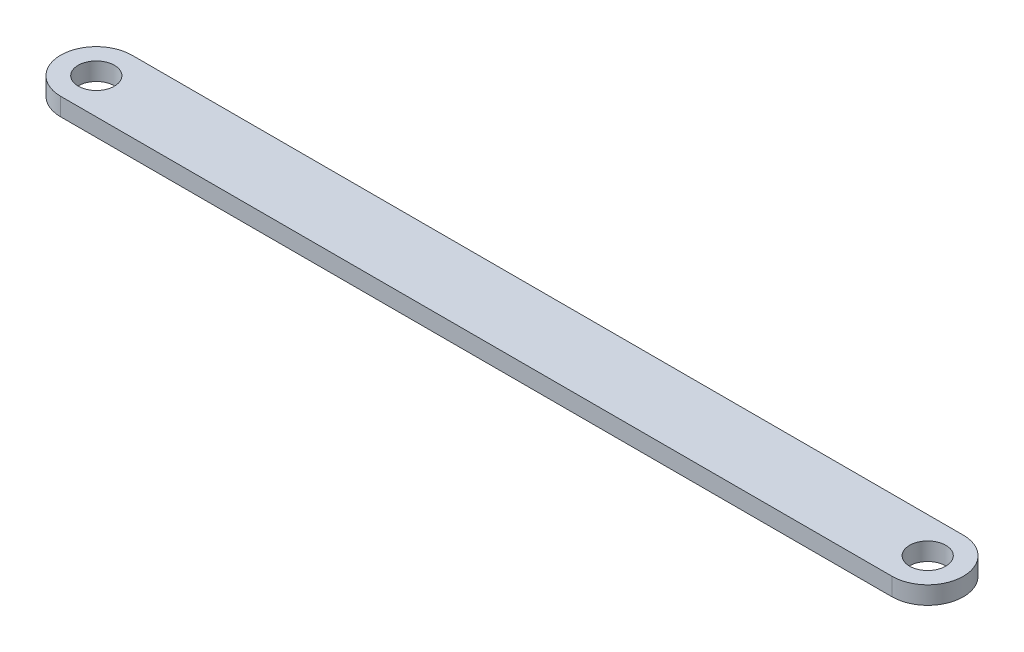
ISO-10303-21;
HEADER;
FILE_DESCRIPTION(('STEP AP214'),'2;1');
FILE_NAME('part.step','',(''),(''),'','','');
FILE_SCHEMA(('AUTOMOTIVE_DESIGN { 1 0 10303 214 1 1 1 1 }'));
ENDSEC;
DATA;
#1=APPLICATION_CONTEXT('core data for automotive mechanical design processes');
#2=APPLICATION_PROTOCOL_DEFINITION('international standard','automotive_design',2000,#1);
#3=PRODUCT_CONTEXT('',#1,'mechanical');
#4=PRODUCT('Part','Part','',(#3));
#5=PRODUCT_RELATED_PRODUCT_CATEGORY('part','',(#4));
#6=PRODUCT_DEFINITION_FORMATION('','',#4);
#7=PRODUCT_DEFINITION_CONTEXT('part definition',#1,'design');
#8=PRODUCT_DEFINITION('design','',#6,#7);
#9=PRODUCT_DEFINITION_SHAPE('','',#8);
#10=(LENGTH_UNIT() NAMED_UNIT(*) SI_UNIT(.MILLI.,.METRE.));
#11=(NAMED_UNIT(*) PLANE_ANGLE_UNIT() SI_UNIT($,.RADIAN.));
#12=(NAMED_UNIT(*) SI_UNIT($,.STERADIAN.) SOLID_ANGLE_UNIT());
#13=UNCERTAINTY_MEASURE_WITH_UNIT(LENGTH_MEASURE(1.E-05),#10,'distance_accuracy_value','');
#14=(GEOMETRIC_REPRESENTATION_CONTEXT(3) GLOBAL_UNCERTAINTY_ASSIGNED_CONTEXT((#13)) GLOBAL_UNIT_ASSIGNED_CONTEXT((#10,
#11,#12)) REPRESENTATION_CONTEXT('',''));
#15=CARTESIAN_POINT('',(0.,0.,0.));
#16=DIRECTION('',(0.,0.,1.));
#17=DIRECTION('',(1.,0.,0.));
#18=AXIS2_PLACEMENT_3D('',#15,#16,#17);
#19=CARTESIAN_POINT('',(0.,3.,0.));
#20=DIRECTION('',(0.,1.,0.));
#21=DIRECTION('',(0.,0.,1.));
#22=AXIS2_PLACEMENT_3D('',#19,#20,#21);
#23=PLANE('',#22);
#24=CARTESIAN_POINT('',(0.,3.,0.));
#25=DIRECTION('',(0.,1.,0.));
#26=DIRECTION('',(0.,0.,1.));
#27=AXIS2_PLACEMENT_3D('',#24,#25,#26);
#28=CIRCLE('',#27,3.05);
#29=CARTESIAN_POINT('',(0.,3.,3.05));
#30=VERTEX_POINT('',#29);
#31=EDGE_CURVE('E108',#30,#30,#28,.T.);
#32=ORIENTED_EDGE('',*,*,#31,.F.);
#33=EDGE_LOOP('',(#32));
#34=FACE_BOUND('',#33,.T.);
#35=CARTESIAN_POINT('',(0.,3.,0.));
#36=DIRECTION('',(0.,1.,0.));
#37=DIRECTION('',(0.,0.,1.));
#38=AXIS2_PLACEMENT_3D('',#35,#36,#37);
#39=CIRCLE('',#38,6.);
#40=CARTESIAN_POINT('',(0.,3.,-6.));
#41=VERTEX_POINT('',#40);
#42=CARTESIAN_POINT('',(0.,3.,6.));
#43=VERTEX_POINT('',#42);
#44=EDGE_CURVE('E93',#41,#43,#39,.T.);
#45=ORIENTED_EDGE('',*,*,#44,.T.);
#46=DIRECTION('',(1.,0.,0.));
#47=VECTOR('',#46,1.);
#48=CARTESIAN_POINT('',(0.,3.,6.));
#49=LINE('',#48,#47);
#50=CARTESIAN_POINT('',(140.,3.,6.));
#51=VERTEX_POINT('',#50);
#52=EDGE_CURVE('E88',#43,#51,#49,.T.);
#53=ORIENTED_EDGE('',*,*,#52,.T.);
#54=CARTESIAN_POINT('',(140.,3.,0.));
#55=DIRECTION('',(0.,1.,0.));
#56=DIRECTION('',(0.,0.,1.));
#57=AXIS2_PLACEMENT_3D('',#54,#55,#56);
#58=CIRCLE('',#57,6.);
#59=CARTESIAN_POINT('',(140.,3.,-6.));
#60=VERTEX_POINT('',#59);
#61=EDGE_CURVE('E91',#51,#60,#58,.T.);
#62=ORIENTED_EDGE('',*,*,#61,.T.);
#63=DIRECTION('',(-1.,0.,0.));
#64=VECTOR('',#63,1.);
#65=CARTESIAN_POINT('',(0.,3.,-6.));
#66=LINE('',#65,#64);
#67=EDGE_CURVE('E58',#60,#41,#66,.T.);
#68=ORIENTED_EDGE('',*,*,#67,.T.);
#69=EDGE_LOOP('',(#45,#53,#62,#68));
#70=FACE_BOUND('',#69,.T.);
#71=CARTESIAN_POINT('',(140.,3.,0.));
#72=DIRECTION('',(0.,1.,0.));
#73=DIRECTION('',(0.,0.,1.));
#74=AXIS2_PLACEMENT_3D('',#71,#72,#73);
#75=CIRCLE('',#74,3.04999999999999);
#76=CARTESIAN_POINT('',(140.,3.,3.04999999999999));
#77=VERTEX_POINT('',#76);
#78=EDGE_CURVE('E123',#77,#77,#75,.T.);
#79=ORIENTED_EDGE('',*,*,#78,.F.);
#80=EDGE_LOOP('',(#79));
#81=FACE_BOUND('',#80,.T.);
#82=ADVANCED_FACE('F41',(#34,#70,#81),#23,.T.);
#83=CARTESIAN_POINT('',(0.,0.,0.));
#84=DIRECTION('',(0.,1.,0.));
#85=DIRECTION('',(0.,0.,1.));
#86=AXIS2_PLACEMENT_3D('',#83,#84,#85);
#87=PLANE('',#86);
#88=CARTESIAN_POINT('',(0.,0.,0.));
#89=DIRECTION('',(0.,1.,0.));
#90=DIRECTION('',(0.,0.,1.));
#91=AXIS2_PLACEMENT_3D('',#88,#89,#90);
#92=CIRCLE('',#91,6.);
#93=CARTESIAN_POINT('',(0.,0.,-6.));
#94=VERTEX_POINT('',#93);
#95=CARTESIAN_POINT('',(0.,0.,6.));
#96=VERTEX_POINT('',#95);
#97=EDGE_CURVE('E105',#94,#96,#92,.T.);
#98=ORIENTED_EDGE('',*,*,#97,.F.);
#99=DIRECTION('',(-1.,0.,0.));
#100=VECTOR('',#99,1.);
#101=CARTESIAN_POINT('',(0.,0.,-6.));
#102=LINE('',#101,#100);
#103=CARTESIAN_POINT('',(140.,0.,-6.));
#104=VERTEX_POINT('',#103);
#105=EDGE_CURVE('E81',#104,#94,#102,.T.);
#106=ORIENTED_EDGE('',*,*,#105,.F.);
#107=CARTESIAN_POINT('',(140.,0.,0.));
#108=DIRECTION('',(0.,1.,0.));
#109=DIRECTION('',(0.,0.,1.));
#110=AXIS2_PLACEMENT_3D('',#107,#108,#109);
#111=CIRCLE('',#110,6.);
#112=CARTESIAN_POINT('',(140.,0.,6.));
#113=VERTEX_POINT('',#112);
#114=EDGE_CURVE('E75',#113,#104,#111,.T.);
#115=ORIENTED_EDGE('',*,*,#114,.F.);
#116=DIRECTION('',(1.,0.,0.));
#117=VECTOR('',#116,1.);
#118=CARTESIAN_POINT('',(0.,0.,6.));
#119=LINE('',#118,#117);
#120=EDGE_CURVE('E97',#96,#113,#119,.T.);
#121=ORIENTED_EDGE('',*,*,#120,.F.);
#122=EDGE_LOOP('',(#98,#106,#115,#121));
#123=FACE_BOUND('',#122,.T.);
#124=CARTESIAN_POINT('',(0.,0.,0.));
#125=DIRECTION('',(0.,1.,0.));
#126=DIRECTION('',(0.,0.,1.));
#127=AXIS2_PLACEMENT_3D('',#124,#125,#126);
#128=CIRCLE('',#127,3.05);
#129=CARTESIAN_POINT('',(0.,0.,3.05));
#130=VERTEX_POINT('',#129);
#131=EDGE_CURVE('E120',#130,#130,#128,.T.);
#132=ORIENTED_EDGE('',*,*,#131,.T.);
#133=EDGE_LOOP('',(#132));
#134=FACE_BOUND('',#133,.T.);
#135=CARTESIAN_POINT('',(140.,0.,0.));
#136=DIRECTION('',(0.,1.,0.));
#137=DIRECTION('',(0.,0.,1.));
#138=AXIS2_PLACEMENT_3D('',#135,#136,#137);
#139=CIRCLE('',#138,3.04999999999999);
#140=CARTESIAN_POINT('',(140.,0.,3.04999999999999));
#141=VERTEX_POINT('',#140);
#142=EDGE_CURVE('E126',#141,#141,#139,.T.);
#143=ORIENTED_EDGE('',*,*,#142,.T.);
#144=EDGE_LOOP('',(#143));
#145=FACE_BOUND('',#144,.T.);
#146=ADVANCED_FACE('F116',(#123,#134,#145),#87,.F.);
#147=CARTESIAN_POINT('',(0.,3.,0.));
#148=DIRECTION('',(0.,-1.,0.));
#149=DIRECTION('',(0.,0.,-1.));
#150=AXIS2_PLACEMENT_3D('',#147,#148,#149);
#151=CYLINDRICAL_SURFACE('',#150,6.);
#152=ORIENTED_EDGE('',*,*,#97,.T.);
#153=DIRECTION('',(0.,-1.,0.));
#154=VECTOR('',#153,1.);
#155=CARTESIAN_POINT('',(0.,3.,6.));
#156=LINE('',#155,#154);
#157=EDGE_CURVE('E11',#43,#96,#156,.T.);
#158=ORIENTED_EDGE('',*,*,#157,.F.);
#159=ORIENTED_EDGE('',*,*,#44,.F.);
#160=DIRECTION('',(0.,-1.,0.));
#161=VECTOR('',#160,1.);
#162=CARTESIAN_POINT('',(0.,3.,-6.));
#163=LINE('',#162,#161);
#164=EDGE_CURVE('E101',#41,#94,#163,.T.);
#165=ORIENTED_EDGE('',*,*,#164,.T.);
#166=EDGE_LOOP('',(#152,#158,#159,#165));
#167=FACE_BOUND('',#166,.T.);
#168=ADVANCED_FACE('F43',(#167),#151,.T.);
#169=CARTESIAN_POINT('',(0.,3.,6.));
#170=DIRECTION('',(0.,0.,-1.));
#171=DIRECTION('',(-1.,0.,0.));
#172=AXIS2_PLACEMENT_3D('',#169,#170,#171);
#173=PLANE('',#172);
#174=ORIENTED_EDGE('',*,*,#120,.T.);
#175=DIRECTION('',(0.,-1.,0.));
#176=VECTOR('',#175,1.);
#177=CARTESIAN_POINT('',(140.,3.,6.));
#178=LINE('',#177,#176);
#179=EDGE_CURVE('E50',#51,#113,#178,.T.);
#180=ORIENTED_EDGE('',*,*,#179,.F.);
#181=ORIENTED_EDGE('',*,*,#52,.F.);
#182=ORIENTED_EDGE('',*,*,#157,.T.);
#183=EDGE_LOOP('',(#174,#180,#181,#182));
#184=FACE_BOUND('',#183,.T.);
#185=ADVANCED_FACE('F96',(#184),#173,.F.);
#186=CARTESIAN_POINT('',(140.,3.,0.));
#187=DIRECTION('',(0.,-1.,0.));
#188=DIRECTION('',(0.,0.,-1.));
#189=AXIS2_PLACEMENT_3D('',#186,#187,#188);
#190=CYLINDRICAL_SURFACE('',#189,6.);
#191=ORIENTED_EDGE('',*,*,#114,.T.);
#192=DIRECTION('',(0.,-1.,0.));
#193=VECTOR('',#192,1.);
#194=CARTESIAN_POINT('',(140.,3.,-6.));
#195=LINE('',#194,#193);
#196=EDGE_CURVE('E98',#60,#104,#195,.T.);
#197=ORIENTED_EDGE('',*,*,#196,.F.);
#198=ORIENTED_EDGE('',*,*,#61,.F.);
#199=ORIENTED_EDGE('',*,*,#179,.T.);
#200=EDGE_LOOP('',(#191,#197,#198,#199));
#201=FACE_BOUND('',#200,.T.);
#202=ADVANCED_FACE('F99',(#201),#190,.T.);
#203=CARTESIAN_POINT('',(0.,3.,-6.));
#204=DIRECTION('',(0.,0.,1.));
#205=DIRECTION('',(1.,0.,0.));
#206=AXIS2_PLACEMENT_3D('',#203,#204,#205);
#207=PLANE('',#206);
#208=ORIENTED_EDGE('',*,*,#105,.T.);
#209=ORIENTED_EDGE('',*,*,#164,.F.);
#210=ORIENTED_EDGE('',*,*,#67,.F.);
#211=ORIENTED_EDGE('',*,*,#196,.T.);
#212=EDGE_LOOP('',(#208,#209,#210,#211));
#213=FACE_BOUND('',#212,.T.);
#214=ADVANCED_FACE('F113',(#213),#207,.F.);
#215=CARTESIAN_POINT('',(0.,3.,0.));
#216=DIRECTION('',(0.,-1.,0.));
#217=DIRECTION('',(0.,0.,-1.));
#218=AXIS2_PLACEMENT_3D('',#215,#216,#217);
#219=CYLINDRICAL_SURFACE('',#218,3.05);
#220=ORIENTED_EDGE('',*,*,#31,.T.);
#221=EDGE_LOOP('',(#220));
#222=FACE_BOUND('',#221,.T.);
#223=ORIENTED_EDGE('',*,*,#131,.F.);
#224=EDGE_LOOP('',(#223));
#225=FACE_BOUND('',#224,.T.);
#226=ADVANCED_FACE('F143',(#222,#225),#219,.F.);
#227=CARTESIAN_POINT('',(140.,3.,0.));
#228=DIRECTION('',(0.,-1.,0.));
#229=DIRECTION('',(0.,0.,-1.));
#230=AXIS2_PLACEMENT_3D('',#227,#228,#229);
#231=CYLINDRICAL_SURFACE('',#230,3.04999999999999);
#232=ORIENTED_EDGE('',*,*,#78,.T.);
#233=EDGE_LOOP('',(#232));
#234=FACE_BOUND('',#233,.T.);
#235=ORIENTED_EDGE('',*,*,#142,.F.);
#236=EDGE_LOOP('',(#235));
#237=FACE_BOUND('',#236,.T.);
#238=ADVANCED_FACE('F132',(#234,#237),#231,.F.);
#239=CLOSED_SHELL('',(#82,#146,#168,#185,#202,#214,#226,#238));
#240=MANIFOLD_SOLID_BREP('B2',#239);
#241=ADVANCED_BREP_SHAPE_REPRESENTATION('',(#18,#240),#14);
#242=SHAPE_DEFINITION_REPRESENTATION(#9,#241);
ENDSEC;
END-ISO-10303-21;
